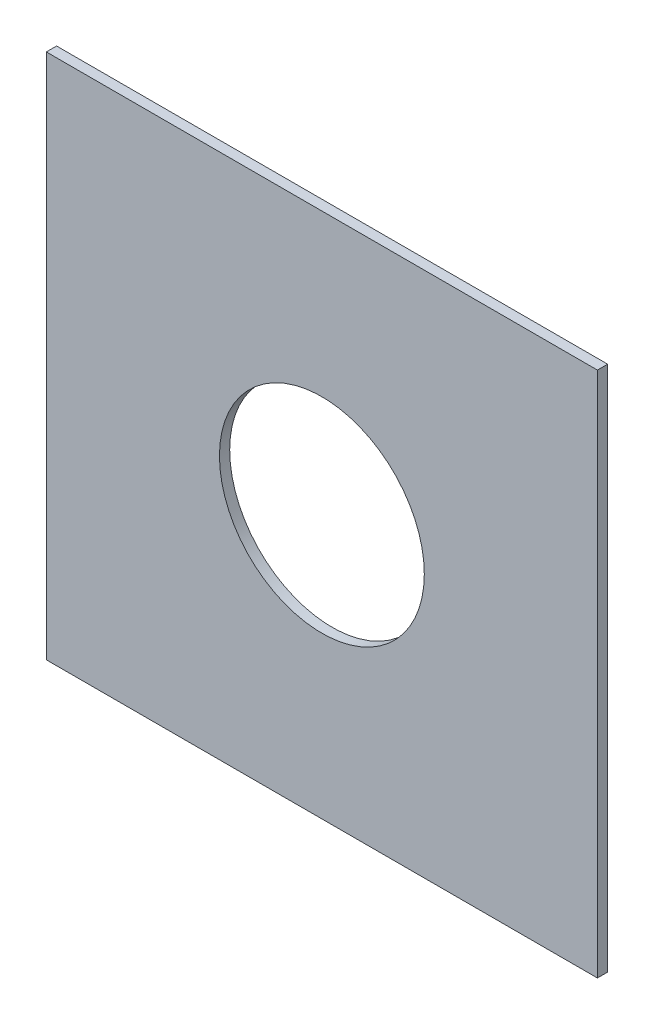
ISO-10303-21;
HEADER;
FILE_DESCRIPTION(('STEP AP214'),'2;1');
FILE_NAME('part.step','',(''),(''),'','','');
FILE_SCHEMA(('AUTOMOTIVE_DESIGN { 1 0 10303 214 1 1 1 1 }'));
ENDSEC;
DATA;
#1=APPLICATION_CONTEXT('core data for automotive mechanical design processes');
#2=APPLICATION_PROTOCOL_DEFINITION('international standard','automotive_design',2000,#1);
#3=PRODUCT_CONTEXT('',#1,'mechanical');
#4=PRODUCT('Part','Part','',(#3));
#5=PRODUCT_RELATED_PRODUCT_CATEGORY('part','',(#4));
#6=PRODUCT_DEFINITION_FORMATION('','',#4);
#7=PRODUCT_DEFINITION_CONTEXT('part definition',#1,'design');
#8=PRODUCT_DEFINITION('design','',#6,#7);
#9=PRODUCT_DEFINITION_SHAPE('','',#8);
#10=(LENGTH_UNIT() NAMED_UNIT(*) SI_UNIT(.MILLI.,.METRE.));
#11=(NAMED_UNIT(*) PLANE_ANGLE_UNIT() SI_UNIT($,.RADIAN.));
#12=(NAMED_UNIT(*) SI_UNIT($,.STERADIAN.) SOLID_ANGLE_UNIT());
#13=UNCERTAINTY_MEASURE_WITH_UNIT(LENGTH_MEASURE(1.E-05),#10,'distance_accuracy_value','');
#14=(GEOMETRIC_REPRESENTATION_CONTEXT(3) GLOBAL_UNCERTAINTY_ASSIGNED_CONTEXT((#13)) GLOBAL_UNIT_ASSIGNED_CONTEXT((#10,
#11,#12)) REPRESENTATION_CONTEXT('',''));
#15=CARTESIAN_POINT('',(0.,0.,0.));
#16=DIRECTION('',(0.,0.,1.));
#17=DIRECTION('',(1.,0.,0.));
#18=AXIS2_PLACEMENT_3D('',#15,#16,#17);
#19=CARTESIAN_POINT('',(0.,0.,1.));
#20=DIRECTION('',(0.,0.,1.));
#21=DIRECTION('',(1.,0.,0.));
#22=AXIS2_PLACEMENT_3D('',#19,#20,#21);
#23=PLANE('',#22);
#24=CARTESIAN_POINT('',(0.,0.,1.));
#25=DIRECTION('',(0.,0.,1.));
#26=DIRECTION('',(1.,0.,0.));
#27=AXIS2_PLACEMENT_3D('',#24,#25,#26);
#28=CIRCLE('',#27,10.);
#29=CARTESIAN_POINT('',(10.,0.,1.));
#30=VERTEX_POINT('',#29);
#31=EDGE_CURVE('E17',#30,#30,#28,.F.);
#32=ORIENTED_EDGE('',*,*,#31,.T.);
#33=EDGE_LOOP('',(#32));
#34=FACE_BOUND('',#33,.T.);
#35=DIRECTION('',(0.,1.,0.));
#36=VECTOR('',#35,1.);
#37=CARTESIAN_POINT('',(26.9,-25.7,1.));
#38=LINE('',#37,#36);
#39=CARTESIAN_POINT('',(26.9,25.7,1.));
#40=VERTEX_POINT('',#39);
#41=CARTESIAN_POINT('',(26.9,-25.7,1.));
#42=VERTEX_POINT('',#41);
#43=EDGE_CURVE('E74',#40,#42,#38,.F.);
#44=ORIENTED_EDGE('',*,*,#43,.F.);
#45=DIRECTION('',(1.,0.,0.));
#46=VECTOR('',#45,1.);
#47=CARTESIAN_POINT('',(-26.9,25.7,1.));
#48=LINE('',#47,#46);
#49=CARTESIAN_POINT('',(-26.9,25.7,1.));
#50=VERTEX_POINT('',#49);
#51=EDGE_CURVE('E65',#40,#50,#48,.F.);
#52=ORIENTED_EDGE('',*,*,#51,.T.);
#53=DIRECTION('',(0.,1.,0.));
#54=VECTOR('',#53,1.);
#55=CARTESIAN_POINT('',(-26.9,25.7,1.));
#56=LINE('',#55,#54);
#57=CARTESIAN_POINT('',(-26.9,-25.7,1.));
#58=VERTEX_POINT('',#57);
#59=EDGE_CURVE('E62',#58,#50,#56,.T.);
#60=ORIENTED_EDGE('',*,*,#59,.F.);
#61=DIRECTION('',(1.,0.,0.));
#62=VECTOR('',#61,1.);
#63=CARTESIAN_POINT('',(26.9,-25.7,1.));
#64=LINE('',#63,#62);
#65=EDGE_CURVE('E52',#58,#42,#64,.T.);
#66=ORIENTED_EDGE('',*,*,#65,.T.);
#67=EDGE_LOOP('',(#44,#52,#60,#66));
#68=FACE_BOUND('',#67,.T.);
#69=ADVANCED_FACE('F14',(#34,#68),#23,.T.);
#70=CARTESIAN_POINT('',(-26.9,25.7,0.));
#71=DIRECTION('',(-1.,0.,0.));
#72=DIRECTION('',(0.,0.,1.));
#73=AXIS2_PLACEMENT_3D('',#70,#71,#72);
#74=PLANE('',#73);
#75=DIRECTION('',(0.,0.,1.));
#76=VECTOR('',#75,1.);
#77=CARTESIAN_POINT('',(-26.9,-25.7,0.));
#78=LINE('',#77,#76);
#79=CARTESIAN_POINT('',(-26.9,-25.7,0.));
#80=VERTEX_POINT('',#79);
#81=EDGE_CURVE('E59',#80,#58,#78,.T.);
#82=ORIENTED_EDGE('',*,*,#81,.T.);
#83=ORIENTED_EDGE('',*,*,#59,.T.);
#84=DIRECTION('',(0.,0.,-1.));
#85=VECTOR('',#84,1.);
#86=CARTESIAN_POINT('',(-26.9,25.7,0.));
#87=LINE('',#86,#85);
#88=CARTESIAN_POINT('',(-26.9,25.7,0.));
#89=VERTEX_POINT('',#88);
#90=EDGE_CURVE('E79',#50,#89,#87,.T.);
#91=ORIENTED_EDGE('',*,*,#90,.T.);
#92=DIRECTION('',(0.,1.,0.));
#93=VECTOR('',#92,1.);
#94=CARTESIAN_POINT('',(-26.9,0.,0.));
#95=LINE('',#94,#93);
#96=EDGE_CURVE('E72',#89,#80,#95,.F.);
#97=ORIENTED_EDGE('',*,*,#96,.T.);
#98=EDGE_LOOP('',(#82,#83,#91,#97));
#99=FACE_BOUND('',#98,.T.);
#100=ADVANCED_FACE('F71',(#99),#74,.T.);
#101=CARTESIAN_POINT('',(26.9,-25.7,0.));
#102=DIRECTION('',(0.,1.,0.));
#103=DIRECTION('',(0.,0.,1.));
#104=AXIS2_PLACEMENT_3D('',#101,#102,#103);
#105=PLANE('',#104);
#106=DIRECTION('',(1.,0.,0.));
#107=VECTOR('',#106,1.);
#108=CARTESIAN_POINT('',(0.,-25.7,0.));
#109=LINE('',#108,#107);
#110=CARTESIAN_POINT('',(26.9,-25.7,0.));
#111=VERTEX_POINT('',#110);
#112=EDGE_CURVE('E83',#80,#111,#109,.T.);
#113=ORIENTED_EDGE('',*,*,#112,.T.);
#114=DIRECTION('',(0.,0.,-1.));
#115=VECTOR('',#114,1.);
#116=CARTESIAN_POINT('',(26.9,-25.7,0.));
#117=LINE('',#116,#115);
#118=EDGE_CURVE('E61',#42,#111,#117,.T.);
#119=ORIENTED_EDGE('',*,*,#118,.F.);
#120=ORIENTED_EDGE('',*,*,#65,.F.);
#121=ORIENTED_EDGE('',*,*,#81,.F.);
#122=EDGE_LOOP('',(#113,#119,#120,#121));
#123=FACE_BOUND('',#122,.T.);
#124=ADVANCED_FACE('F57',(#123),#105,.F.);
#125=CARTESIAN_POINT('',(26.9,-25.7,0.));
#126=DIRECTION('',(1.,0.,0.));
#127=DIRECTION('',(0.,0.,-1.));
#128=AXIS2_PLACEMENT_3D('',#125,#126,#127);
#129=PLANE('',#128);
#130=DIRECTION('',(0.,0.,-1.));
#131=VECTOR('',#130,1.);
#132=CARTESIAN_POINT('',(26.9,25.7,0.));
#133=LINE('',#132,#131);
#134=CARTESIAN_POINT('',(26.9,25.7,0.));
#135=VERTEX_POINT('',#134);
#136=EDGE_CURVE('E31',#135,#40,#133,.F.);
#137=ORIENTED_EDGE('',*,*,#136,.T.);
#138=ORIENTED_EDGE('',*,*,#43,.T.);
#139=ORIENTED_EDGE('',*,*,#118,.T.);
#140=DIRECTION('',(0.,1.,0.));
#141=VECTOR('',#140,1.);
#142=CARTESIAN_POINT('',(26.9,0.,0.));
#143=LINE('',#142,#141);
#144=EDGE_CURVE('E85',#111,#135,#143,.T.);
#145=ORIENTED_EDGE('',*,*,#144,.T.);
#146=EDGE_LOOP('',(#137,#138,#139,#145));
#147=FACE_BOUND('',#146,.T.);
#148=ADVANCED_FACE('F93',(#147),#129,.T.);
#149=CARTESIAN_POINT('',(-26.9,25.7,0.));
#150=DIRECTION('',(0.,-1.,0.));
#151=DIRECTION('',(0.,0.,-1.));
#152=AXIS2_PLACEMENT_3D('',#149,#150,#151);
#153=PLANE('',#152);
#154=DIRECTION('',(1.,0.,0.));
#155=VECTOR('',#154,1.);
#156=CARTESIAN_POINT('',(0.,25.7,0.));
#157=LINE('',#156,#155);
#158=EDGE_CURVE('E23',#135,#89,#157,.F.);
#159=ORIENTED_EDGE('',*,*,#158,.T.);
#160=ORIENTED_EDGE('',*,*,#90,.F.);
#161=ORIENTED_EDGE('',*,*,#51,.F.);
#162=ORIENTED_EDGE('',*,*,#136,.F.);
#163=EDGE_LOOP('',(#159,#160,#161,#162));
#164=FACE_BOUND('',#163,.T.);
#165=ADVANCED_FACE('F88',(#164),#153,.F.);
#166=CARTESIAN_POINT('',(0.,0.,-0.160000000765));
#167=DIRECTION('',(0.,0.,1.));
#168=DIRECTION('',(1.,0.,0.));
#169=AXIS2_PLACEMENT_3D('',#166,#167,#168);
#170=CYLINDRICAL_SURFACE('',#169,10.);
#171=ORIENTED_EDGE('',*,*,#31,.F.);
#172=EDGE_LOOP('',(#171));
#173=FACE_BOUND('',#172,.T.);
#174=CARTESIAN_POINT('',(0.,0.,0.));
#175=DIRECTION('',(0.,0.,1.));
#176=DIRECTION('',(1.,0.,0.));
#177=AXIS2_PLACEMENT_3D('',#174,#175,#176);
#178=CIRCLE('',#177,10.);
#179=CARTESIAN_POINT('',(10.,0.,0.));
#180=VERTEX_POINT('',#179);
#181=EDGE_CURVE('E9',#180,#180,#178,.F.);
#182=ORIENTED_EDGE('',*,*,#181,.T.);
#183=EDGE_LOOP('',(#182));
#184=FACE_BOUND('',#183,.T.);
#185=ADVANCED_FACE('F101',(#173,#184),#170,.F.);
#186=CARTESIAN_POINT('',(0.,0.,0.));
#187=DIRECTION('',(0.,0.,1.));
#188=DIRECTION('',(1.,0.,0.));
#189=AXIS2_PLACEMENT_3D('',#186,#187,#188);
#190=PLANE('',#189);
#191=ORIENTED_EDGE('',*,*,#181,.F.);
#192=EDGE_LOOP('',(#191));
#193=FACE_BOUND('',#192,.T.);
#194=ORIENTED_EDGE('',*,*,#144,.F.);
#195=ORIENTED_EDGE('',*,*,#112,.F.);
#196=ORIENTED_EDGE('',*,*,#96,.F.);
#197=ORIENTED_EDGE('',*,*,#158,.F.);
#198=EDGE_LOOP('',(#194,#195,#196,#197));
#199=FACE_BOUND('',#198,.T.);
#200=ADVANCED_FACE('F91',(#193,#199),#190,.F.);
#201=CLOSED_SHELL('',(#69,#100,#124,#148,#165,#185,#200));
#202=MANIFOLD_SOLID_BREP('B1',#201);
#203=ADVANCED_BREP_SHAPE_REPRESENTATION('',(#18,#202),#14);
#204=SHAPE_DEFINITION_REPRESENTATION(#9,#203);
ENDSEC;
END-ISO-10303-21;
